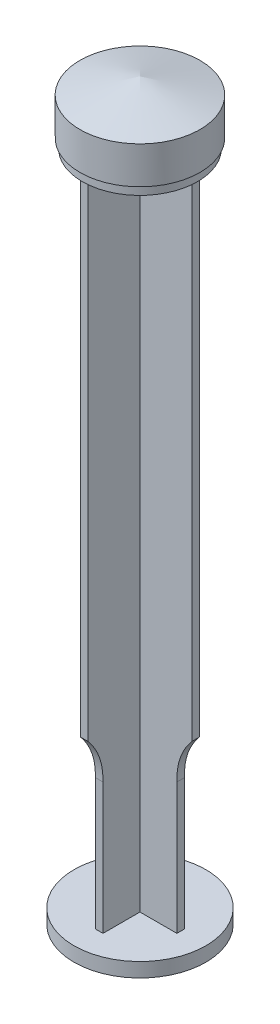
ISO-10303-21;
HEADER;
FILE_DESCRIPTION(('STEP AP214'),'2;1');
FILE_NAME('part.step','',(''),(''),'','','');
FILE_SCHEMA(('AUTOMOTIVE_DESIGN { 1 0 10303 214 1 1 1 1 }'));
ENDSEC;
DATA;
#1=APPLICATION_CONTEXT('core data for automotive mechanical design processes');
#2=APPLICATION_PROTOCOL_DEFINITION('international standard','automotive_design',2000,#1);
#3=PRODUCT_CONTEXT('',#1,'mechanical');
#4=PRODUCT('Part','Part','',(#3));
#5=PRODUCT_RELATED_PRODUCT_CATEGORY('part','',(#4));
#6=PRODUCT_DEFINITION_FORMATION('','',#4);
#7=PRODUCT_DEFINITION_CONTEXT('part definition',#1,'design');
#8=PRODUCT_DEFINITION('design','',#6,#7);
#9=PRODUCT_DEFINITION_SHAPE('','',#8);
#10=(LENGTH_UNIT() NAMED_UNIT(*) SI_UNIT(.MILLI.,.METRE.));
#11=(NAMED_UNIT(*) PLANE_ANGLE_UNIT() SI_UNIT($,.RADIAN.));
#12=(NAMED_UNIT(*) SI_UNIT($,.STERADIAN.) SOLID_ANGLE_UNIT());
#13=UNCERTAINTY_MEASURE_WITH_UNIT(LENGTH_MEASURE(1.E-05),#10,'distance_accuracy_value','');
#14=(GEOMETRIC_REPRESENTATION_CONTEXT(3) GLOBAL_UNCERTAINTY_ASSIGNED_CONTEXT((#13)) GLOBAL_UNIT_ASSIGNED_CONTEXT((#10,
#11,#12)) REPRESENTATION_CONTEXT('',''));
#15=CARTESIAN_POINT('',(0.,0.,0.));
#16=DIRECTION('',(0.,0.,1.));
#17=DIRECTION('',(1.,0.,0.));
#18=AXIS2_PLACEMENT_3D('',#15,#16,#17);
#19=CARTESIAN_POINT('',(-6.99999999999997,84.55,-0.475000000000002));
#20=DIRECTION('',(0.,0.,1.));
#21=DIRECTION('',(1.,0.,0.));
#22=AXIS2_PLACEMENT_3D('',#19,#20,#21);
#23=PLANE('',#22);
#24=DIRECTION('',(0.,-1.,0.));
#25=VECTOR('',#24,1.);
#26=CARTESIAN_POINT('',(-5.125,84.55,-0.475000000000002));
#27=LINE('',#26,#25);
#28=CARTESIAN_POINT('',(-5.125,18.3,-0.475000000000002));
#29=VERTEX_POINT('',#28);
#30=CARTESIAN_POINT('',(-5.125,1.8,-0.475000000000001));
#31=VERTEX_POINT('',#30);
#32=EDGE_CURVE('E378',#29,#31,#27,.T.);
#33=ORIENTED_EDGE('',*,*,#32,.F.);
#34=CARTESIAN_POINT('',(-5.125,18.3,-0.475000000000002));
#35=CARTESIAN_POINT('',(-5.02840034035996,21.345891771607,-0.475000000000002));
#36=CARTESIAN_POINT('',(-6.99999999999998,23.65,-0.475000000000002));
#37=B_SPLINE_CURVE_WITH_KNOTS('',2,(#34,#35,#36),.UNSPECIFIED.,.F.,.F.,(3,3),(0.,1.),.UNSPECIFIED.);
#38=CARTESIAN_POINT('',(-6.99999999999998,23.65,-0.475000000000002));
#39=VERTEX_POINT('',#38);
#40=EDGE_CURVE('E789',#39,#29,#37,.F.);
#41=ORIENTED_EDGE('',*,*,#40,.F.);
#42=DIRECTION('',(0.,-1.,0.));
#43=VECTOR('',#42,1.);
#44=CARTESIAN_POINT('',(-6.99999999999997,84.55,-0.475000000000002));
#45=LINE('',#44,#43);
#46=CARTESIAN_POINT('',(-6.99999999999997,84.55,-0.475000000000002));
#47=VERTEX_POINT('',#46);
#48=EDGE_CURVE('E252',#47,#39,#45,.T.);
#49=ORIENTED_EDGE('',*,*,#48,.F.);
#50=DIRECTION('',(-1.,0.,0.));
#51=VECTOR('',#50,1.);
#52=CARTESIAN_POINT('',(-6.99999999999997,84.55,-0.475000000000002));
#53=LINE('',#52,#51);
#54=CARTESIAN_POINT('',(-0.475,84.55,-0.475));
#55=VERTEX_POINT('',#54);
#56=EDGE_CURVE('E219',#55,#47,#53,.T.);
#57=ORIENTED_EDGE('',*,*,#56,.F.);
#58=DIRECTION('',(0.,-1.,0.));
#59=VECTOR('',#58,1.);
#60=CARTESIAN_POINT('',(-0.475,84.55,-0.475));
#61=LINE('',#60,#59);
#62=CARTESIAN_POINT('',(-0.475,1.8,-0.475));
#63=VERTEX_POINT('',#62);
#64=EDGE_CURVE('E220',#55,#63,#61,.T.);
#65=ORIENTED_EDGE('',*,*,#64,.T.);
#66=DIRECTION('',(-1.,0.,0.));
#67=VECTOR('',#66,1.);
#68=CARTESIAN_POINT('',(-6.99999999999997,1.8,-0.475000000000002));
#69=LINE('',#68,#67);
#70=EDGE_CURVE('E349',#63,#31,#69,.T.);
#71=ORIENTED_EDGE('',*,*,#70,.T.);
#72=EDGE_LOOP('',(#33,#41,#49,#57,#65,#71));
#73=FACE_BOUND('',#72,.T.);
#74=ADVANCED_FACE('F41',(#73),#23,.F.);
#75=CARTESIAN_POINT('',(-6.99999999999998,84.55,0.474999999999988));
#76=DIRECTION('',(1.,0.,0.));
#77=DIRECTION('',(0.,0.,-1.));
#78=AXIS2_PLACEMENT_3D('',#75,#76,#77);
#79=PLANE('',#78);
#80=DIRECTION('',(0.,0.,-1.));
#81=VECTOR('',#80,1.);
#82=CARTESIAN_POINT('',(-6.99999999999998,23.65,2.));
#83=LINE('',#82,#81);
#84=CARTESIAN_POINT('',(-6.99999999999998,23.65,0.474999999999988));
#85=VERTEX_POINT('',#84);
#86=EDGE_CURVE('E201',#85,#39,#83,.T.);
#87=ORIENTED_EDGE('',*,*,#86,.F.);
#88=DIRECTION('',(0.,-1.,0.));
#89=VECTOR('',#88,1.);
#90=CARTESIAN_POINT('',(-6.99999999999998,84.55,0.474999999999988));
#91=LINE('',#90,#89);
#92=CARTESIAN_POINT('',(-6.99999999999998,84.55,0.474999999999988));
#93=VERTEX_POINT('',#92);
#94=EDGE_CURVE('E249',#93,#85,#91,.T.);
#95=ORIENTED_EDGE('',*,*,#94,.F.);
#96=DIRECTION('',(0.,0.,1.));
#97=VECTOR('',#96,1.);
#98=CARTESIAN_POINT('',(-6.99999999999998,84.55,0.474999999999988));
#99=LINE('',#98,#97);
#100=EDGE_CURVE('E317',#47,#93,#99,.T.);
#101=ORIENTED_EDGE('',*,*,#100,.F.);
#102=ORIENTED_EDGE('',*,*,#48,.T.);
#103=EDGE_LOOP('',(#87,#95,#101,#102));
#104=FACE_BOUND('',#103,.T.);
#105=ADVANCED_FACE('F305',(#104),#79,.F.);
#106=CARTESIAN_POINT('',(-0.475,84.55,0.475000000000001));
#107=DIRECTION('',(0.,0.,-1.));
#108=DIRECTION('',(-1.,0.,0.));
#109=AXIS2_PLACEMENT_3D('',#106,#107,#108);
#110=PLANE('',#109);
#111=DIRECTION('',(0.,1.,0.));
#112=VECTOR('',#111,1.);
#113=CARTESIAN_POINT('',(-5.125,84.55,0.474999999999992));
#114=LINE('',#113,#112);
#115=CARTESIAN_POINT('',(-5.125,1.8,0.474999999999992));
#116=VERTEX_POINT('',#115);
#117=CARTESIAN_POINT('',(-5.125,18.3,0.475000000000001));
#118=VERTEX_POINT('',#117);
#119=EDGE_CURVE('E11',#116,#118,#114,.T.);
#120=ORIENTED_EDGE('',*,*,#119,.F.);
#121=DIRECTION('',(1.,0.,0.));
#122=VECTOR('',#121,1.);
#123=CARTESIAN_POINT('',(-0.475,1.8,0.475000000000001));
#124=LINE('',#123,#122);
#125=CARTESIAN_POINT('',(-0.475,1.8,0.475000000000001));
#126=VERTEX_POINT('',#125);
#127=EDGE_CURVE('E352',#116,#126,#124,.T.);
#128=ORIENTED_EDGE('',*,*,#127,.T.);
#129=DIRECTION('',(0.,-1.,0.));
#130=VECTOR('',#129,1.);
#131=CARTESIAN_POINT('',(-0.475,84.55,0.475000000000001));
#132=LINE('',#131,#130);
#133=CARTESIAN_POINT('',(-0.475,84.55,0.475000000000001));
#134=VERTEX_POINT('',#133);
#135=EDGE_CURVE('E246',#134,#126,#132,.T.);
#136=ORIENTED_EDGE('',*,*,#135,.F.);
#137=DIRECTION('',(1.,0.,0.));
#138=VECTOR('',#137,1.);
#139=CARTESIAN_POINT('',(-0.475,84.55,0.475000000000001));
#140=LINE('',#139,#138);
#141=EDGE_CURVE('E311',#93,#134,#140,.T.);
#142=ORIENTED_EDGE('',*,*,#141,.F.);
#143=ORIENTED_EDGE('',*,*,#94,.T.);
#144=CARTESIAN_POINT('',(-5.125,18.3,0.475000000000001));
#145=CARTESIAN_POINT('',(-5.02840034035996,21.345891771607,0.475000000000001));
#146=CARTESIAN_POINT('',(-6.99999999999998,23.65,0.475000000000001));
#147=B_SPLINE_CURVE_WITH_KNOTS('',2,(#144,#145,#146),.UNSPECIFIED.,.F.,.F.,(3,3),(0.,1.),.UNSPECIFIED.);
#148=EDGE_CURVE('E50',#118,#85,#147,.T.);
#149=ORIENTED_EDGE('',*,*,#148,.F.);
#150=EDGE_LOOP('',(#120,#128,#136,#142,#143,#149));
#151=FACE_BOUND('',#150,.T.);
#152=ADVANCED_FACE('F309',(#151),#110,.F.);
#153=CARTESIAN_POINT('',(6.99999999999999,84.55,0.475000000000007));
#154=DIRECTION('',(0.,0.,-1.));
#155=DIRECTION('',(-1.,0.,0.));
#156=AXIS2_PLACEMENT_3D('',#153,#154,#155);
#157=PLANE('',#156);
#158=CARTESIAN_POINT('',(6.99999999999998,23.65,0.475000000000007));
#159=CARTESIAN_POINT('',(5.02840034035996,21.345891771607,0.475000000000007));
#160=CARTESIAN_POINT('',(5.125,18.3,0.475000000000007));
#161=B_SPLINE_CURVE_WITH_KNOTS('',2,(#158,#159,#160),.UNSPECIFIED.,.F.,.F.,(3,3),(0.,1.),.UNSPECIFIED.);
#162=CARTESIAN_POINT('',(6.99999999999998,23.65,0.475000000000007));
#163=VERTEX_POINT('',#162);
#164=CARTESIAN_POINT('',(5.125,18.3,0.475000000000006));
#165=VERTEX_POINT('',#164);
#166=EDGE_CURVE('E188',#163,#165,#161,.T.);
#167=ORIENTED_EDGE('',*,*,#166,.F.);
#168=DIRECTION('',(0.,-1.,0.));
#169=VECTOR('',#168,1.);
#170=CARTESIAN_POINT('',(6.99999999999999,84.55,0.475000000000007));
#171=LINE('',#170,#169);
#172=CARTESIAN_POINT('',(6.99999999999999,84.55,0.475000000000007));
#173=VERTEX_POINT('',#172);
#174=EDGE_CURVE('E236',#173,#163,#171,.T.);
#175=ORIENTED_EDGE('',*,*,#174,.F.);
#176=DIRECTION('',(1.,0.,0.));
#177=VECTOR('',#176,1.);
#178=CARTESIAN_POINT('',(6.99999999999999,84.55,0.475000000000007));
#179=LINE('',#178,#177);
#180=CARTESIAN_POINT('',(0.475,84.55,0.475000000000001));
#181=VERTEX_POINT('',#180);
#182=EDGE_CURVE('E333',#181,#173,#179,.T.);
#183=ORIENTED_EDGE('',*,*,#182,.F.);
#184=DIRECTION('',(0.,-1.,0.));
#185=VECTOR('',#184,1.);
#186=CARTESIAN_POINT('',(0.475,84.55,0.475000000000001));
#187=LINE('',#186,#185);
#188=CARTESIAN_POINT('',(0.475,1.8,0.475000000000001));
#189=VERTEX_POINT('',#188);
#190=EDGE_CURVE('E206',#181,#189,#187,.T.);
#191=ORIENTED_EDGE('',*,*,#190,.T.);
#192=DIRECTION('',(1.,0.,0.));
#193=VECTOR('',#192,1.);
#194=CARTESIAN_POINT('',(6.99999999999999,1.8,0.475000000000007));
#195=LINE('',#194,#193);
#196=CARTESIAN_POINT('',(5.125,1.8,0.475000000000006));
#197=VERTEX_POINT('',#196);
#198=EDGE_CURVE('E198',#189,#197,#195,.T.);
#199=ORIENTED_EDGE('',*,*,#198,.T.);
#200=DIRECTION('',(0.,-1.,0.));
#201=VECTOR('',#200,1.);
#202=CARTESIAN_POINT('',(5.125,84.55,0.475000000000006));
#203=LINE('',#202,#201);
#204=EDGE_CURVE('E178',#165,#197,#203,.T.);
#205=ORIENTED_EDGE('',*,*,#204,.F.);
#206=EDGE_LOOP('',(#167,#175,#183,#191,#199,#205));
#207=FACE_BOUND('',#206,.T.);
#208=ADVANCED_FACE('F204',(#207),#157,.F.);
#209=CARTESIAN_POINT('',(6.99999999999997,84.55,-0.475));
#210=DIRECTION('',(-1.,0.,0.));
#211=DIRECTION('',(0.,0.,1.));
#212=AXIS2_PLACEMENT_3D('',#209,#210,#211);
#213=PLANE('',#212);
#214=DIRECTION('',(0.,0.,-1.));
#215=VECTOR('',#214,1.);
#216=CARTESIAN_POINT('',(6.99999999999998,23.65,2.));
#217=LINE('',#216,#215);
#218=CARTESIAN_POINT('',(6.99999999999998,23.65,-0.475));
#219=VERTEX_POINT('',#218);
#220=EDGE_CURVE('E748',#163,#219,#217,.T.);
#221=ORIENTED_EDGE('',*,*,#220,.T.);
#222=DIRECTION('',(0.,-1.,0.));
#223=VECTOR('',#222,1.);
#224=CARTESIAN_POINT('',(6.99999999999997,84.55,-0.475));
#225=LINE('',#224,#223);
#226=CARTESIAN_POINT('',(6.99999999999997,84.55,-0.475));
#227=VERTEX_POINT('',#226);
#228=EDGE_CURVE('E233',#227,#219,#225,.T.);
#229=ORIENTED_EDGE('',*,*,#228,.F.);
#230=DIRECTION('',(0.,0.,-1.));
#231=VECTOR('',#230,1.);
#232=CARTESIAN_POINT('',(6.99999999999997,84.55,-0.475));
#233=LINE('',#232,#231);
#234=EDGE_CURVE('E336',#173,#227,#233,.T.);
#235=ORIENTED_EDGE('',*,*,#234,.F.);
#236=ORIENTED_EDGE('',*,*,#174,.T.);
#237=EDGE_LOOP('',(#221,#229,#235,#236));
#238=FACE_BOUND('',#237,.T.);
#239=ADVANCED_FACE('F438',(#238),#213,.F.);
#240=CARTESIAN_POINT('',(0.475,84.55,-0.475));
#241=DIRECTION('',(0.,0.,1.));
#242=DIRECTION('',(1.,0.,0.));
#243=AXIS2_PLACEMENT_3D('',#240,#241,#242);
#244=PLANE('',#243);
#245=CARTESIAN_POINT('',(6.99999999999998,23.65,-0.475));
#246=CARTESIAN_POINT('',(5.02840034035996,21.345891771607,-0.475));
#247=CARTESIAN_POINT('',(5.125,18.3,-0.475));
#248=B_SPLINE_CURVE_WITH_KNOTS('',2,(#245,#246,#247),.UNSPECIFIED.,.F.,.F.,(3,3),(0.,1.),.UNSPECIFIED.);
#249=CARTESIAN_POINT('',(5.125,18.3,-0.475));
#250=VERTEX_POINT('',#249);
#251=EDGE_CURVE('E287',#250,#219,#248,.F.);
#252=ORIENTED_EDGE('',*,*,#251,.F.);
#253=DIRECTION('',(0.,1.,0.));
#254=VECTOR('',#253,1.);
#255=CARTESIAN_POINT('',(5.125,84.55,-0.475));
#256=LINE('',#255,#254);
#257=CARTESIAN_POINT('',(5.125,1.8,-0.475));
#258=VERTEX_POINT('',#257);
#259=EDGE_CURVE('E285',#258,#250,#256,.T.);
#260=ORIENTED_EDGE('',*,*,#259,.F.);
#261=DIRECTION('',(-1.,0.,0.));
#262=VECTOR('',#261,1.);
#263=CARTESIAN_POINT('',(0.475,1.8,-0.475));
#264=LINE('',#263,#262);
#265=CARTESIAN_POINT('',(0.475,1.8,-0.475));
#266=VERTEX_POINT('',#265);
#267=EDGE_CURVE('E200',#258,#266,#264,.T.);
#268=ORIENTED_EDGE('',*,*,#267,.T.);
#269=DIRECTION('',(0.,-1.,0.));
#270=VECTOR('',#269,1.);
#271=CARTESIAN_POINT('',(0.475,84.55,-0.475));
#272=LINE('',#271,#270);
#273=CARTESIAN_POINT('',(0.475,84.55,-0.475));
#274=VERTEX_POINT('',#273);
#275=EDGE_CURVE('E230',#274,#266,#272,.T.);
#276=ORIENTED_EDGE('',*,*,#275,.F.);
#277=DIRECTION('',(-1.,0.,0.));
#278=VECTOR('',#277,1.);
#279=CARTESIAN_POINT('',(0.475,84.55,-0.475));
#280=LINE('',#279,#278);
#281=EDGE_CURVE('E339',#227,#274,#280,.T.);
#282=ORIENTED_EDGE('',*,*,#281,.F.);
#283=ORIENTED_EDGE('',*,*,#228,.T.);
#284=EDGE_LOOP('',(#252,#260,#268,#276,#282,#283));
#285=FACE_BOUND('',#284,.T.);
#286=ADVANCED_FACE('F435',(#285),#244,.F.);
#287=CARTESIAN_POINT('',(-0.475000000000004,84.55,6.99999999999996));
#288=DIRECTION('',(1.,0.,0.));
#289=DIRECTION('',(0.,0.,-1.));
#290=AXIS2_PLACEMENT_3D('',#287,#288,#289);
#291=PLANE('',#290);
#292=DIRECTION('',(0.,-1.,0.));
#293=VECTOR('',#292,1.);
#294=CARTESIAN_POINT('',(-0.475000000000003,84.55,5.125));
#295=LINE('',#294,#293);
#296=CARTESIAN_POINT('',(-0.475000000000005,18.3,5.125));
#297=VERTEX_POINT('',#296);
#298=CARTESIAN_POINT('',(-0.475000000000003,1.8,5.125));
#299=VERTEX_POINT('',#298);
#300=EDGE_CURVE('E360',#297,#299,#295,.T.);
#301=ORIENTED_EDGE('',*,*,#300,.F.);
#302=CARTESIAN_POINT('',(-0.475000000000006,18.3,5.125));
#303=CARTESIAN_POINT('',(-0.475000000000006,21.3387368003838,5.05954918686191));
#304=CARTESIAN_POINT('',(-0.475000000000004,23.65,6.99999999999996));
#305=B_SPLINE_CURVE_WITH_KNOTS('',2,(#302,#303,#304),.UNSPECIFIED.,.F.,.F.,(3,3),(0.,1.),.UNSPECIFIED.);
#306=CARTESIAN_POINT('',(-0.475000000000004,23.65,6.99999999999996));
#307=VERTEX_POINT('',#306);
#308=EDGE_CURVE('E769',#307,#297,#305,.F.);
#309=ORIENTED_EDGE('',*,*,#308,.F.);
#310=DIRECTION('',(0.,-1.,0.));
#311=VECTOR('',#310,1.);
#312=CARTESIAN_POINT('',(-0.475000000000004,84.55,6.99999999999996));
#313=LINE('',#312,#311);
#314=CARTESIAN_POINT('',(-0.475000000000004,84.55,6.99999999999996));
#315=VERTEX_POINT('',#314);
#316=EDGE_CURVE('E243',#315,#307,#313,.T.);
#317=ORIENTED_EDGE('',*,*,#316,.F.);
#318=DIRECTION('',(0.,0.,1.));
#319=VECTOR('',#318,1.);
#320=CARTESIAN_POINT('',(-0.475000000000004,84.55,6.99999999999996));
#321=LINE('',#320,#319);
#322=EDGE_CURVE('E316',#134,#315,#321,.T.);
#323=ORIENTED_EDGE('',*,*,#322,.F.);
#324=ORIENTED_EDGE('',*,*,#135,.T.);
#325=DIRECTION('',(0.,0.,1.));
#326=VECTOR('',#325,1.);
#327=CARTESIAN_POINT('',(-0.475000000000004,1.8,6.99999999999996));
#328=LINE('',#327,#326);
#329=EDGE_CURVE('E211',#126,#299,#328,.T.);
#330=ORIENTED_EDGE('',*,*,#329,.T.);
#331=EDGE_LOOP('',(#301,#309,#317,#323,#324,#330));
#332=FACE_BOUND('',#331,.T.);
#333=ADVANCED_FACE('F358',(#332),#291,.F.);
#334=CARTESIAN_POINT('',(0.475000000000004,84.55,6.99999999999996));
#335=DIRECTION('',(0.,0.,-1.));
#336=DIRECTION('',(-1.,0.,0.));
#337=AXIS2_PLACEMENT_3D('',#334,#335,#336);
#338=PLANE('',#337);
#339=DIRECTION('',(-1.,0.,0.));
#340=VECTOR('',#339,1.);
#341=CARTESIAN_POINT('',(2.475,23.65,6.99999999999996));
#342=LINE('',#341,#340);
#343=CARTESIAN_POINT('',(0.475000000000004,23.65,6.99999999999996));
#344=VERTEX_POINT('',#343);
#345=EDGE_CURVE('E370',#344,#307,#342,.T.);
#346=ORIENTED_EDGE('',*,*,#345,.F.);
#347=DIRECTION('',(0.,-1.,0.));
#348=VECTOR('',#347,1.);
#349=CARTESIAN_POINT('',(0.475000000000004,84.55,6.99999999999996));
#350=LINE('',#349,#348);
#351=CARTESIAN_POINT('',(0.475000000000004,84.55,6.99999999999996));
#352=VERTEX_POINT('',#351);
#353=EDGE_CURVE('E240',#352,#344,#350,.T.);
#354=ORIENTED_EDGE('',*,*,#353,.F.);
#355=DIRECTION('',(1.,0.,0.));
#356=VECTOR('',#355,1.);
#357=CARTESIAN_POINT('',(0.475000000000004,84.55,6.99999999999996));
#358=LINE('',#357,#356);
#359=EDGE_CURVE('E327',#315,#352,#358,.T.);
#360=ORIENTED_EDGE('',*,*,#359,.F.);
#361=ORIENTED_EDGE('',*,*,#316,.T.);
#362=EDGE_LOOP('',(#346,#354,#360,#361));
#363=FACE_BOUND('',#362,.T.);
#364=ADVANCED_FACE('F447',(#363),#338,.F.);
#365=CARTESIAN_POINT('',(0.475,84.55,0.475000000000001));
#366=DIRECTION('',(-1.,0.,0.));
#367=DIRECTION('',(0.,0.,1.));
#368=AXIS2_PLACEMENT_3D('',#365,#366,#367);
#369=PLANE('',#368);
#370=DIRECTION('',(0.,1.,0.));
#371=VECTOR('',#370,1.);
#372=CARTESIAN_POINT('',(0.475000000000003,84.55,5.125));
#373=LINE('',#372,#371);
#374=CARTESIAN_POINT('',(0.475000000000003,1.8,5.125));
#375=VERTEX_POINT('',#374);
#376=CARTESIAN_POINT('',(0.475000000000003,18.3,5.125));
#377=VERTEX_POINT('',#376);
#378=EDGE_CURVE('E280',#375,#377,#373,.T.);
#379=ORIENTED_EDGE('',*,*,#378,.F.);
#380=DIRECTION('',(0.,0.,-1.));
#381=VECTOR('',#380,1.);
#382=CARTESIAN_POINT('',(0.475,1.8,0.475000000000001));
#383=LINE('',#382,#381);
#384=EDGE_CURVE('E207',#375,#189,#383,.T.);
#385=ORIENTED_EDGE('',*,*,#384,.T.);
#386=ORIENTED_EDGE('',*,*,#190,.F.);
#387=DIRECTION('',(0.,0.,-1.));
#388=VECTOR('',#387,1.);
#389=CARTESIAN_POINT('',(0.475,84.55,0.475000000000001));
#390=LINE('',#389,#388);
#391=EDGE_CURVE('E330',#352,#181,#390,.T.);
#392=ORIENTED_EDGE('',*,*,#391,.F.);
#393=ORIENTED_EDGE('',*,*,#353,.T.);
#394=CARTESIAN_POINT('',(0.475000000000003,18.3,5.125));
#395=CARTESIAN_POINT('',(0.475000000000003,21.3387368003838,5.05954918686191));
#396=CARTESIAN_POINT('',(0.475000000000004,23.65,6.99999999999996));
#397=B_SPLINE_CURVE_WITH_KNOTS('',2,(#394,#395,#396),.UNSPECIFIED.,.F.,.F.,(3,3),(0.,1.),.UNSPECIFIED.);
#398=EDGE_CURVE('E273',#377,#344,#397,.T.);
#399=ORIENTED_EDGE('',*,*,#398,.F.);
#400=EDGE_LOOP('',(#379,#385,#386,#392,#393,#399));
#401=FACE_BOUND('',#400,.T.);
#402=ADVANCED_FACE('F433',(#401),#369,.F.);
#403=CARTESIAN_POINT('',(0.475000000000001,84.55,-6.99999999999995));
#404=DIRECTION('',(-1.,0.,0.));
#405=DIRECTION('',(0.,0.,1.));
#406=AXIS2_PLACEMENT_3D('',#403,#404,#405);
#407=PLANE('',#406);
#408=CARTESIAN_POINT('',(0.475000000000001,23.65,-6.99999999999996));
#409=CARTESIAN_POINT('',(0.475000000000002,21.3387368003838,-5.05954918686191));
#410=CARTESIAN_POINT('',(0.475000000000002,18.3,-5.125));
#411=B_SPLINE_CURVE_WITH_KNOTS('',2,(#408,#409,#410),.UNSPECIFIED.,.F.,.F.,(3,3),(0.,1.),.UNSPECIFIED.);
#412=CARTESIAN_POINT('',(0.475000000000001,23.65,-6.99999999999996));
#413=VERTEX_POINT('',#412);
#414=CARTESIAN_POINT('',(0.475000000000001,18.3,-5.125));
#415=VERTEX_POINT('',#414);
#416=EDGE_CURVE('E368',#413,#415,#411,.T.);
#417=ORIENTED_EDGE('',*,*,#416,.F.);
#418=DIRECTION('',(0.,-1.,0.));
#419=VECTOR('',#418,1.);
#420=CARTESIAN_POINT('',(0.475000000000001,84.55,-6.99999999999995));
#421=LINE('',#420,#419);
#422=CARTESIAN_POINT('',(0.475000000000001,84.55,-6.99999999999995));
#423=VERTEX_POINT('',#422);
#424=EDGE_CURVE('E227',#423,#413,#421,.T.);
#425=ORIENTED_EDGE('',*,*,#424,.F.);
#426=DIRECTION('',(0.,0.,-1.));
#427=VECTOR('',#426,1.);
#428=CARTESIAN_POINT('',(0.475000000000001,84.55,-6.99999999999995));
#429=LINE('',#428,#427);
#430=EDGE_CURVE('E342',#274,#423,#429,.T.);
#431=ORIENTED_EDGE('',*,*,#430,.F.);
#432=ORIENTED_EDGE('',*,*,#275,.T.);
#433=DIRECTION('',(0.,0.,-1.));
#434=VECTOR('',#433,1.);
#435=CARTESIAN_POINT('',(0.475000000000001,1.8,-6.99999999999995));
#436=LINE('',#435,#434);
#437=CARTESIAN_POINT('',(0.475000000000001,1.8,-5.125));
#438=VERTEX_POINT('',#437);
#439=EDGE_CURVE('E209',#266,#438,#436,.T.);
#440=ORIENTED_EDGE('',*,*,#439,.T.);
#441=DIRECTION('',(0.,-1.,0.));
#442=VECTOR('',#441,1.);
#443=CARTESIAN_POINT('',(0.475000000000001,84.55,-5.125));
#444=LINE('',#443,#442);
#445=EDGE_CURVE('E366',#415,#438,#444,.T.);
#446=ORIENTED_EDGE('',*,*,#445,.F.);
#447=EDGE_LOOP('',(#417,#425,#431,#432,#440,#446));
#448=FACE_BOUND('',#447,.T.);
#449=ADVANCED_FACE('F429',(#448),#407,.F.);
#450=CARTESIAN_POINT('',(-0.475000000000001,84.55,-6.99999999999995));
#451=DIRECTION('',(0.,0.,1.));
#452=DIRECTION('',(1.,0.,0.));
#453=AXIS2_PLACEMENT_3D('',#450,#451,#452);
#454=PLANE('',#453);
#455=DIRECTION('',(-1.,0.,0.));
#456=VECTOR('',#455,1.);
#457=CARTESIAN_POINT('',(2.475,23.65,-6.99999999999996));
#458=LINE('',#457,#456);
#459=CARTESIAN_POINT('',(-0.475000000000003,23.65,-6.99999999999996));
#460=VERTEX_POINT('',#459);
#461=EDGE_CURVE('E374',#413,#460,#458,.T.);
#462=ORIENTED_EDGE('',*,*,#461,.T.);
#463=DIRECTION('',(0.,-1.,0.));
#464=VECTOR('',#463,1.);
#465=CARTESIAN_POINT('',(-0.475000000000001,84.55,-6.99999999999995));
#466=LINE('',#465,#464);
#467=CARTESIAN_POINT('',(-0.475000000000001,84.55,-6.99999999999995));
#468=VERTEX_POINT('',#467);
#469=EDGE_CURVE('E223',#468,#460,#466,.T.);
#470=ORIENTED_EDGE('',*,*,#469,.F.);
#471=DIRECTION('',(-1.,0.,0.));
#472=VECTOR('',#471,1.);
#473=CARTESIAN_POINT('',(-0.475000000000001,84.55,-6.99999999999995));
#474=LINE('',#473,#472);
#475=EDGE_CURVE('E345',#423,#468,#474,.T.);
#476=ORIENTED_EDGE('',*,*,#475,.F.);
#477=ORIENTED_EDGE('',*,*,#424,.T.);
#478=EDGE_LOOP('',(#462,#470,#476,#477));
#479=FACE_BOUND('',#478,.T.);
#480=ADVANCED_FACE('F425',(#479),#454,.F.);
#481=CARTESIAN_POINT('',(-0.475,84.55,-0.475));
#482=DIRECTION('',(1.,0.,0.));
#483=DIRECTION('',(0.,0.,-1.));
#484=AXIS2_PLACEMENT_3D('',#481,#482,#483);
#485=PLANE('',#484);
#486=CARTESIAN_POINT('',(-0.475000000000003,23.65,-6.99999999999996));
#487=CARTESIAN_POINT('',(-0.475000000000002,21.3387368003838,-5.05954918686191));
#488=CARTESIAN_POINT('',(-0.475000000000002,18.3,-5.125));
#489=B_SPLINE_CURVE_WITH_KNOTS('',2,(#486,#487,#488),.UNSPECIFIED.,.F.,.F.,(3,3),(0.,1.),.UNSPECIFIED.);
#490=CARTESIAN_POINT('',(-0.475000000000001,18.3,-5.125));
#491=VERTEX_POINT('',#490);
#492=EDGE_CURVE('E269',#491,#460,#489,.F.);
#493=ORIENTED_EDGE('',*,*,#492,.F.);
#494=DIRECTION('',(0.,1.,0.));
#495=VECTOR('',#494,1.);
#496=CARTESIAN_POINT('',(-0.475000000000001,84.55,-5.125));
#497=LINE('',#496,#495);
#498=CARTESIAN_POINT('',(-0.475000000000001,1.8,-5.125));
#499=VERTEX_POINT('',#498);
#500=EDGE_CURVE('E267',#499,#491,#497,.T.);
#501=ORIENTED_EDGE('',*,*,#500,.F.);
#502=DIRECTION('',(0.,0.,1.));
#503=VECTOR('',#502,1.);
#504=CARTESIAN_POINT('',(-0.475,1.8,-0.475));
#505=LINE('',#504,#503);
#506=EDGE_CURVE('E217',#499,#63,#505,.T.);
#507=ORIENTED_EDGE('',*,*,#506,.T.);
#508=ORIENTED_EDGE('',*,*,#64,.F.);
#509=DIRECTION('',(0.,0.,1.));
#510=VECTOR('',#509,1.);
#511=CARTESIAN_POINT('',(-0.475,84.55,-0.475));
#512=LINE('',#511,#510);
#513=EDGE_CURVE('E224',#468,#55,#512,.T.);
#514=ORIENTED_EDGE('',*,*,#513,.F.);
#515=ORIENTED_EDGE('',*,*,#469,.T.);
#516=EDGE_LOOP('',(#493,#501,#507,#508,#514,#515));
#517=FACE_BOUND('',#516,.T.);
#518=ADVANCED_FACE('F422',(#517),#485,.F.);
#519=CARTESIAN_POINT('',(0.,1.8,0.));
#520=DIRECTION('',(0.,1.,0.));
#521=DIRECTION('',(0.,0.,1.));
#522=AXIS2_PLACEMENT_3D('',#519,#520,#521);
#523=PLANE('',#522);
#524=DIRECTION('',(0.,0.,-1.));
#525=VECTOR('',#524,1.);
#526=CARTESIAN_POINT('',(-5.125,1.8,2.));
#527=LINE('',#526,#525);
#528=EDGE_CURVE('E189',#116,#31,#527,.T.);
#529=ORIENTED_EDGE('',*,*,#528,.T.);
#530=ORIENTED_EDGE('',*,*,#70,.F.);
#531=ORIENTED_EDGE('',*,*,#506,.F.);
#532=DIRECTION('',(-1.,0.,0.));
#533=VECTOR('',#532,1.);
#534=CARTESIAN_POINT('',(2.475,1.8,-5.125));
#535=LINE('',#534,#533);
#536=EDGE_CURVE('E381',#438,#499,#535,.T.);
#537=ORIENTED_EDGE('',*,*,#536,.F.);
#538=ORIENTED_EDGE('',*,*,#439,.F.);
#539=ORIENTED_EDGE('',*,*,#267,.F.);
#540=DIRECTION('',(0.,0.,-1.));
#541=VECTOR('',#540,1.);
#542=CARTESIAN_POINT('',(5.125,1.8,2.));
#543=LINE('',#542,#541);
#544=EDGE_CURVE('E181',#197,#258,#543,.T.);
#545=ORIENTED_EDGE('',*,*,#544,.F.);
#546=ORIENTED_EDGE('',*,*,#198,.F.);
#547=ORIENTED_EDGE('',*,*,#384,.F.);
#548=DIRECTION('',(-1.,0.,0.));
#549=VECTOR('',#548,1.);
#550=CARTESIAN_POINT('',(2.475,1.8,5.125));
#551=LINE('',#550,#549);
#552=EDGE_CURVE('E363',#375,#299,#551,.T.);
#553=ORIENTED_EDGE('',*,*,#552,.T.);
#554=ORIENTED_EDGE('',*,*,#329,.F.);
#555=ORIENTED_EDGE('',*,*,#127,.F.);
#556=EDGE_LOOP('',(#529,#530,#531,#537,#538,#539,#545,#546,#547,#553,#554,#555));
#557=FACE_BOUND('',#556,.T.);
#558=CARTESIAN_POINT('',(0.,1.8,0.));
#559=DIRECTION('',(0.,1.,0.));
#560=DIRECTION('',(0.,0.,1.));
#561=AXIS2_PLACEMENT_3D('',#558,#559,#560);
#562=CIRCLE('',#561,8.3);
#563=CARTESIAN_POINT('',(0.,1.8,8.3));
#564=VERTEX_POINT('',#563);
#565=EDGE_CURVE('E256',#564,#564,#562,.T.);
#566=ORIENTED_EDGE('',*,*,#565,.T.);
#567=EDGE_LOOP('',(#566));
#568=FACE_BOUND('',#567,.T.);
#569=ADVANCED_FACE('F195',(#557,#568),#523,.T.);
#570=CARTESIAN_POINT('',(0.,1.8,0.));
#571=DIRECTION('',(0.,-1.,0.));
#572=DIRECTION('',(0.,0.,-1.));
#573=AXIS2_PLACEMENT_3D('',#570,#571,#572);
#574=CYLINDRICAL_SURFACE('',#573,8.3);
#575=ORIENTED_EDGE('',*,*,#565,.F.);
#576=EDGE_LOOP('',(#575));
#577=FACE_BOUND('',#576,.T.);
#578=CARTESIAN_POINT('',(0.,0.,0.));
#579=DIRECTION('',(0.,1.,0.));
#580=DIRECTION('',(0.,0.,1.));
#581=AXIS2_PLACEMENT_3D('',#578,#579,#580);
#582=CIRCLE('',#581,8.3);
#583=CARTESIAN_POINT('',(0.,0.,8.3));
#584=VERTEX_POINT('',#583);
#585=EDGE_CURVE('E255',#584,#584,#582,.T.);
#586=ORIENTED_EDGE('',*,*,#585,.T.);
#587=EDGE_LOOP('',(#586));
#588=FACE_BOUND('',#587,.T.);
#589=ADVANCED_FACE('F463',(#577,#588),#574,.T.);
#590=CARTESIAN_POINT('',(0.,0.,0.));
#591=DIRECTION('',(0.,1.,0.));
#592=DIRECTION('',(0.,0.,1.));
#593=AXIS2_PLACEMENT_3D('',#590,#591,#592);
#594=PLANE('',#593);
#595=ORIENTED_EDGE('',*,*,#585,.F.);
#596=EDGE_LOOP('',(#595));
#597=FACE_BOUND('',#596,.T.);
#598=ADVANCED_FACE('F417',(#597),#594,.F.);
#599=CARTESIAN_POINT('',(0.,84.55,0.));
#600=DIRECTION('',(0.,1.,0.));
#601=DIRECTION('',(0.,0.,1.));
#602=AXIS2_PLACEMENT_3D('',#599,#600,#601);
#603=PLANE('',#602);
#604=CARTESIAN_POINT('',(0.,84.55,0.));
#605=DIRECTION('',(0.,1.,0.));
#606=DIRECTION('',(0.,0.,1.));
#607=AXIS2_PLACEMENT_3D('',#604,#605,#606);
#608=CIRCLE('',#607,7.25);
#609=CARTESIAN_POINT('',(0.,84.55,7.25));
#610=VERTEX_POINT('',#609);
#611=EDGE_CURVE('E816',#610,#610,#608,.T.);
#612=ORIENTED_EDGE('',*,*,#611,.F.);
#613=EDGE_LOOP('',(#612));
#614=FACE_BOUND('',#613,.T.);
#615=ORIENTED_EDGE('',*,*,#513,.T.);
#616=ORIENTED_EDGE('',*,*,#56,.T.);
#617=ORIENTED_EDGE('',*,*,#100,.T.);
#618=ORIENTED_EDGE('',*,*,#141,.T.);
#619=ORIENTED_EDGE('',*,*,#322,.T.);
#620=ORIENTED_EDGE('',*,*,#359,.T.);
#621=ORIENTED_EDGE('',*,*,#391,.T.);
#622=ORIENTED_EDGE('',*,*,#182,.T.);
#623=ORIENTED_EDGE('',*,*,#234,.T.);
#624=ORIENTED_EDGE('',*,*,#281,.T.);
#625=ORIENTED_EDGE('',*,*,#430,.T.);
#626=ORIENTED_EDGE('',*,*,#475,.T.);
#627=EDGE_LOOP('',(#615,#616,#617,#618,#619,#620,#621,#622,#623,#624,#625,#626));
#628=FACE_BOUND('',#627,.T.);
#629=ADVANCED_FACE('F321',(#614,#628),#603,.F.);
#630=CARTESIAN_POINT('',(0.,85.7,0.));
#631=DIRECTION('',(0.,-1.,0.));
#632=DIRECTION('',(0.,0.,-1.));
#633=AXIS2_PLACEMENT_3D('',#630,#631,#632);
#634=CYLINDRICAL_SURFACE('',#633,7.25);
#635=CARTESIAN_POINT('',(0.,85.7,0.));
#636=DIRECTION('',(0.,1.,0.));
#637=DIRECTION('',(0.,0.,1.));
#638=AXIS2_PLACEMENT_3D('',#635,#636,#637);
#639=CIRCLE('',#638,7.25);
#640=CARTESIAN_POINT('',(0.,85.7,7.25));
#641=VERTEX_POINT('',#640);
#642=EDGE_CURVE('E353',#641,#641,#639,.T.);
#643=ORIENTED_EDGE('',*,*,#642,.F.);
#644=EDGE_LOOP('',(#643));
#645=FACE_BOUND('',#644,.T.);
#646=ORIENTED_EDGE('',*,*,#611,.T.);
#647=EDGE_LOOP('',(#646));
#648=FACE_BOUND('',#647,.T.);
#649=ADVANCED_FACE('F413',(#645,#648),#634,.T.);
#650=CARTESIAN_POINT('',(0.,92.4,0.));
#651=DIRECTION('',(0.,-1.,0.));
#652=DIRECTION('',(0.,0.,-1.));
#653=AXIS2_PLACEMENT_3D('',#650,#651,#652);
#654=CYLINDRICAL_SURFACE('',#653,7.55);
#655=CARTESIAN_POINT('',(0.,90.377,0.));
#656=DIRECTION('',(0.,1.,0.));
#657=DIRECTION('',(0.,0.,1.));
#658=AXIS2_PLACEMENT_3D('',#655,#656,#657);
#659=CIRCLE('',#658,7.55);
#660=CARTESIAN_POINT('',(0.,90.377,-7.55000000000002));
#661=VERTEX_POINT('',#660);
#662=EDGE_CURVE('E264',#661,#661,#659,.F.);
#663=ORIENTED_EDGE('',*,*,#662,.T.);
#664=EDGE_LOOP('',(#663));
#665=FACE_BOUND('',#664,.T.);
#666=CARTESIAN_POINT('',(0.,85.7,0.));
#667=DIRECTION('',(0.,1.,0.));
#668=DIRECTION('',(0.,0.,1.));
#669=AXIS2_PLACEMENT_3D('',#666,#667,#668);
#670=CIRCLE('',#669,7.55);
#671=CARTESIAN_POINT('',(0.,85.7,7.55));
#672=VERTEX_POINT('',#671);
#673=EDGE_CURVE('E813',#672,#672,#670,.T.);
#674=ORIENTED_EDGE('',*,*,#673,.T.);
#675=EDGE_LOOP('',(#674));
#676=FACE_BOUND('',#675,.T.);
#677=ADVANCED_FACE('F406',(#665,#676),#654,.T.);
#678=CARTESIAN_POINT('',(0.,92.4,0.));
#679=DIRECTION('',(0.,1.,0.));
#680=DIRECTION('',(0.,0.,1.));
#681=AXIS2_PLACEMENT_3D('',#678,#679,#680);
#682=PLANE('',#681);
#683=CARTESIAN_POINT('',(0.,92.4,0.));
#684=DIRECTION('',(0.,1.,0.));
#685=DIRECTION('',(0.,0.,1.));
#686=AXIS2_PLACEMENT_3D('',#683,#684,#685);
#687=CIRCLE('',#686,6.12162881913347E-05);
#688=CARTESIAN_POINT('',(0.,92.4,-6.1216288217231E-05));
#689=VERTEX_POINT('',#688);
#690=EDGE_CURVE('E259',#689,#689,#687,.T.);
#691=ORIENTED_EDGE('',*,*,#690,.T.);
#692=EDGE_LOOP('',(#691));
#693=FACE_BOUND('',#692,.T.);
#694=ADVANCED_FACE('F402',(#693),#682,.T.);
#695=CARTESIAN_POINT('',(0.,85.7,0.));
#696=DIRECTION('',(0.,1.,0.));
#697=DIRECTION('',(0.,0.,1.));
#698=AXIS2_PLACEMENT_3D('',#695,#696,#697);
#699=PLANE('',#698);
#700=ORIENTED_EDGE('',*,*,#642,.T.);
#701=EDGE_LOOP('',(#700));
#702=FACE_BOUND('',#701,.T.);
#703=ORIENTED_EDGE('',*,*,#673,.F.);
#704=EDGE_LOOP('',(#703));
#705=FACE_BOUND('',#704,.T.);
#706=ADVANCED_FACE('F405',(#702,#705),#699,.F.);
#707=CARTESIAN_POINT('',(0.,92.4,0.));
#708=DIRECTION('',(0.,-1.,0.));
#709=DIRECTION('',(0.,0.,-1.));
#710=AXIS2_PLACEMENT_3D('',#707,#708,#709);
#711=CONICAL_SURFACE('',#710,6.12162881913347E-05,1.30899693899575);
#712=CARTESIAN_POINT('',(0.,90.377,-7.55000000000002));
#713=CARTESIAN_POINT('',(0.,90.3980729166666,-7.47135480433636));
#714=CARTESIAN_POINT('',(0.,90.4191458333333,-7.3927096086727));
#715=CARTESIAN_POINT('',(0.,90.4612916666667,-7.23541921734537));
#716=CARTESIAN_POINT('',(0.,90.4823645833333,-7.1567740216817));
#717=CARTESIAN_POINT('',(0.,90.5245104166667,-6.99948363035437));
#718=CARTESIAN_POINT('',(0.,90.5455833333333,-6.92083843469071));
#719=CARTESIAN_POINT('',(0.,90.5877291666667,-6.76354804336338));
#720=CARTESIAN_POINT('',(0.,90.6088020833333,-6.68490284769971));
#721=CARTESIAN_POINT('',(0.,90.6509479166667,-6.52761245637239));
#722=CARTESIAN_POINT('',(0.,90.6720208333333,-6.44896726070872));
#723=CARTESIAN_POINT('',(0.,90.7141666666667,-6.29167686938139));
#724=CARTESIAN_POINT('',(0.,90.7352395833333,-6.21303167371773));
#725=CARTESIAN_POINT('',(0.,90.7773854166667,-6.0557412823904));
#726=CARTESIAN_POINT('',(0.,90.7984583333333,-5.97709608672673));
#727=CARTESIAN_POINT('',(0.,90.8406041666667,-5.8198056953994));
#728=CARTESIAN_POINT('',(0.,90.8616770833333,-5.74116049973574));
#729=CARTESIAN_POINT('',(0.,90.9038229166667,-5.58387010840841));
#730=CARTESIAN_POINT('',(0.,90.9248958333333,-5.50522491274474));
#731=CARTESIAN_POINT('',(0.,90.9670416666667,-5.34793452141742));
#732=CARTESIAN_POINT('',(0.,90.9881145833333,-5.26928932575375));
#733=CARTESIAN_POINT('',(0.,91.0302604166667,-5.11199893442642));
#734=CARTESIAN_POINT('',(0.,91.0513333333333,-5.03335373876275));
#735=CARTESIAN_POINT('',(0.,91.0934791666667,-4.87606334743543));
#736=CARTESIAN_POINT('',(0.,91.1145520833333,-4.79741815177176));
#737=CARTESIAN_POINT('',(0.,91.1566979166667,-4.64012776044443));
#738=CARTESIAN_POINT('',(0.,91.1777708333333,-4.56148256478077));
#739=CARTESIAN_POINT('',(0.,91.2199166666667,-4.40419217345344));
#740=CARTESIAN_POINT('',(0.,91.2409895833333,-4.32554697778977));
#741=CARTESIAN_POINT('',(0.,91.2831354166667,-4.16825658646244));
#742=CARTESIAN_POINT('',(0.,91.3042083333333,-4.08961139079878));
#743=CARTESIAN_POINT('',(0.,91.3463541666667,-3.93232099947145));
#744=CARTESIAN_POINT('',(0.,91.3674270833333,-3.85367580380779));
#745=CARTESIAN_POINT('',(0.,91.4095729166666,-3.69638541248046));
#746=CARTESIAN_POINT('',(0.,91.4306458333333,-3.61774021681679));
#747=CARTESIAN_POINT('',(0.,91.4727916666667,-3.46044982548946));
#748=CARTESIAN_POINT('',(0.,91.4938645833333,-3.3818046298258));
#749=CARTESIAN_POINT('',(0.,91.5360104166667,-3.22451423849847));
#750=CARTESIAN_POINT('',(0.,91.5570833333333,-3.1458690428348));
#751=CARTESIAN_POINT('',(0.,91.5992291666667,-2.98857865150747));
#752=CARTESIAN_POINT('',(0.,91.6203020833333,-2.90993345584381));
#753=CARTESIAN_POINT('',(0.,91.6624479166667,-2.75264306451648));
#754=CARTESIAN_POINT('',(0.,91.6835208333333,-2.67399786885282));
#755=CARTESIAN_POINT('',(0.,91.7256666666667,-2.51670747752549));
#756=CARTESIAN_POINT('',(0.,91.7467395833333,-2.43806228186182));
#757=CARTESIAN_POINT('',(0.,91.7888854166667,-2.28077189053449));
#758=CARTESIAN_POINT('',(0.,91.8099583333333,-2.20212669487083));
#759=CARTESIAN_POINT('',(0.,91.8521041666667,-2.0448363035435));
#760=CARTESIAN_POINT('',(0.,91.8731770833333,-1.96619110787983));
#761=CARTESIAN_POINT('',(0.,91.9153229166667,-1.8089007165525));
#762=CARTESIAN_POINT('',(0.,91.9363958333333,-1.73025552088884));
#763=CARTESIAN_POINT('',(0.,91.9785416666667,-1.57296512956151));
#764=CARTESIAN_POINT('',(0.,91.9996145833333,-1.49431993389785));
#765=CARTESIAN_POINT('',(0.,92.0417604166667,-1.33702954257052));
#766=CARTESIAN_POINT('',(0.,92.0628333333333,-1.25838434690685));
#767=CARTESIAN_POINT('',(0.,92.1049791666667,-1.10109395557952));
#768=CARTESIAN_POINT('',(0.,92.1260520833333,-1.02244875991586));
#769=CARTESIAN_POINT('',(0.,92.1681979166667,-0.865158368588529));
#770=CARTESIAN_POINT('',(0.,92.1892708333333,-0.786513172924864));
#771=CARTESIAN_POINT('',(0.,92.2314166666667,-0.629222781597534));
#772=CARTESIAN_POINT('',(0.,92.2524895833333,-0.55057758593387));
#773=CARTESIAN_POINT('',(0.,92.2946354166667,-0.393287194606541));
#774=CARTESIAN_POINT('',(0.,92.3157083333333,-0.314641998942876));
#775=CARTESIAN_POINT('',(0.,92.3578541666667,-0.157351607615547));
#776=CARTESIAN_POINT('',(0.,92.3789270833333,-0.0787064119518818));
#777=CARTESIAN_POINT('',(0.,92.4,-6.1216288217231E-05));
#778=B_SPLINE_CURVE_WITH_KNOTS('',3,(#712,#713,#714,#715,#716,#717,#718,#719,#720,#721,#722,
#723,#724,#725,#726,#727,#728,#729,#730,#731,#732,#733,#734,#735,#736,#737,#738,#739,#740,#741,
#742,#743,#744,#745,#746,#747,#748,#749,#750,#751,#752,#753,#754,#755,#756,#757,#758,#759,#760,
#761,#762,#763,#764,#765,#766,#767,#768,#769,#770,#771,#772,#773,#774,#775,#776,#777),
.UNSPECIFIED.,.F.,.F.,(4,2,2,2,2,2,2,2,2,2,2,2,2,2,2,2,2,2,2,2,2,2,2,2,2,2,2,2,2,2,2,2,4),(0.,
0.24425849332285,0.488516986645696,0.732775479968542,0.977033973291392,1.22129246661424,
1.46555095993708,1.70980945325993,1.95406794658278,2.19832643990563,2.44258493322847,
2.68684342655132,2.93110191987417,3.17536041319702,3.41961890651986,3.66387739984271,
3.90813589316555,4.1523943864884,4.39665287981125,4.6409113731341,4.88516986645695,
5.12942835977979,5.37368685310264,5.61794534642549,5.86220383974833,6.10646233307118,
6.35072082639403,6.59497931971688,6.83923781303973,7.08349630636257,7.32775479968542,
7.57201329300826,7.81627178633111),.UNSPECIFIED.);
#779=EDGE_CURVE('BSEAM44',#661,#689,#778,.T.);
#780=ORIENTED_EDGE('',*,*,#662,.F.);
#781=ORIENTED_EDGE('',*,*,#690,.F.);
#782=ORIENTED_EDGE('',*,*,#779,.T.);
#783=ORIENTED_EDGE('',*,*,#779,.F.);
#784=EDGE_LOOP('',(#780,#782,#781,#783));
#785=FACE_BOUND('',#784,.T.);
#786=ADVANCED_FACE('F44',(#785),#711,.T.);
#787=CARTESIAN_POINT('',(2.475,23.65,-6.99999999999996));
#788=CARTESIAN_POINT('',(2.475,21.3387368003838,-5.05954918686191));
#789=CARTESIAN_POINT('',(2.475,18.3,-5.125));
#790=B_SPLINE_CURVE_WITH_KNOTS('',2,(#787,#788,#789),.UNSPECIFIED.,.F.,.F.,(3,3),(0.,1.),.UNSPECIFIED.);
#791=DIRECTION('',(-1.,0.,0.));
#792=VECTOR('',#791,1.);
#793=SURFACE_OF_LINEAR_EXTRUSION('',#790,#792);
#794=ORIENTED_EDGE('',*,*,#416,.T.);
#795=DIRECTION('',(-1.,0.,0.));
#796=VECTOR('',#795,1.);
#797=CARTESIAN_POINT('',(2.475,18.3,-5.125));
#798=LINE('',#797,#796);
#799=EDGE_CURVE('E377',#415,#491,#798,.T.);
#800=ORIENTED_EDGE('',*,*,#799,.T.);
#801=ORIENTED_EDGE('',*,*,#492,.T.);
#802=ORIENTED_EDGE('',*,*,#461,.F.);
#803=EDGE_LOOP('',(#794,#800,#801,#802));
#804=FACE_BOUND('',#803,.T.);
#805=ADVANCED_FACE('F391',(#804),#793,.T.);
#806=CARTESIAN_POINT('',(2.475,1.8,-5.125));
#807=DIRECTION('',(0.,0.,-1.));
#808=DIRECTION('',(-1.,0.,0.));
#809=AXIS2_PLACEMENT_3D('',#806,#807,#808);
#810=PLANE('',#809);
#811=ORIENTED_EDGE('',*,*,#445,.T.);
#812=ORIENTED_EDGE('',*,*,#536,.T.);
#813=ORIENTED_EDGE('',*,*,#500,.T.);
#814=ORIENTED_EDGE('',*,*,#799,.F.);
#815=EDGE_LOOP('',(#811,#812,#813,#814));
#816=FACE_BOUND('',#815,.T.);
#817=ADVANCED_FACE('F395',(#816),#810,.T.);
#818=CARTESIAN_POINT('',(2.475,1.8,5.125));
#819=DIRECTION('',(0.,0.,1.));
#820=DIRECTION('',(1.,0.,0.));
#821=AXIS2_PLACEMENT_3D('',#818,#819,#820);
#822=PLANE('',#821);
#823=ORIENTED_EDGE('',*,*,#300,.T.);
#824=ORIENTED_EDGE('',*,*,#552,.F.);
#825=ORIENTED_EDGE('',*,*,#378,.T.);
#826=DIRECTION('',(-1.,0.,0.));
#827=VECTOR('',#826,1.);
#828=CARTESIAN_POINT('',(2.475,18.3,5.125));
#829=LINE('',#828,#827);
#830=EDGE_CURVE('E64',#377,#297,#829,.T.);
#831=ORIENTED_EDGE('',*,*,#830,.T.);
#832=EDGE_LOOP('',(#823,#824,#825,#831));
#833=FACE_BOUND('',#832,.T.);
#834=ADVANCED_FACE('F397',(#833),#822,.T.);
#835=CARTESIAN_POINT('',(2.475,18.3,5.125));
#836=CARTESIAN_POINT('',(2.475,21.3387368003838,5.05954918686191));
#837=CARTESIAN_POINT('',(2.475,23.65,6.99999999999996));
#838=B_SPLINE_CURVE_WITH_KNOTS('',2,(#835,#836,#837),.UNSPECIFIED.,.F.,.F.,(3,3),(0.,1.),.UNSPECIFIED.);
#839=DIRECTION('',(-1.,0.,0.));
#840=VECTOR('',#839,1.);
#841=SURFACE_OF_LINEAR_EXTRUSION('',#838,#840);
#842=ORIENTED_EDGE('',*,*,#308,.T.);
#843=ORIENTED_EDGE('',*,*,#830,.F.);
#844=ORIENTED_EDGE('',*,*,#398,.T.);
#845=ORIENTED_EDGE('',*,*,#345,.T.);
#846=EDGE_LOOP('',(#842,#843,#844,#845));
#847=FACE_BOUND('',#846,.T.);
#848=ADVANCED_FACE('F598',(#847),#841,.T.);
#849=CARTESIAN_POINT('',(6.99999999999998,23.65,2.));
#850=CARTESIAN_POINT('',(5.02840034035996,21.345891771607,2.));
#851=CARTESIAN_POINT('',(5.125,18.3,2.));
#852=B_SPLINE_CURVE_WITH_KNOTS('',2,(#849,#850,#851),.UNSPECIFIED.,.F.,.F.,(3,3),(0.,1.),.UNSPECIFIED.);
#853=DIRECTION('',(0.,0.,-1.));
#854=VECTOR('',#853,1.);
#855=SURFACE_OF_LINEAR_EXTRUSION('',#852,#854);
#856=ORIENTED_EDGE('',*,*,#166,.T.);
#857=DIRECTION('',(0.,0.,-1.));
#858=VECTOR('',#857,1.);
#859=CARTESIAN_POINT('',(5.125,18.3,2.));
#860=LINE('',#859,#858);
#861=EDGE_CURVE('E184',#165,#250,#860,.T.);
#862=ORIENTED_EDGE('',*,*,#861,.T.);
#863=ORIENTED_EDGE('',*,*,#251,.T.);
#864=ORIENTED_EDGE('',*,*,#220,.F.);
#865=EDGE_LOOP('',(#856,#862,#863,#864));
#866=FACE_BOUND('',#865,.T.);
#867=ADVANCED_FACE('F604',(#866),#855,.T.);
#868=CARTESIAN_POINT('',(5.125,1.8,2.));
#869=DIRECTION('',(1.,0.,0.));
#870=DIRECTION('',(0.,1.,0.));
#871=AXIS2_PLACEMENT_3D('',#868,#869,#870);
#872=PLANE('',#871);
#873=ORIENTED_EDGE('',*,*,#204,.T.);
#874=ORIENTED_EDGE('',*,*,#544,.T.);
#875=ORIENTED_EDGE('',*,*,#259,.T.);
#876=ORIENTED_EDGE('',*,*,#861,.F.);
#877=EDGE_LOOP('',(#873,#874,#875,#876));
#878=FACE_BOUND('',#877,.T.);
#879=ADVANCED_FACE('F180',(#878),#872,.T.);
#880=CARTESIAN_POINT('',(-5.125,1.8,2.));
#881=DIRECTION('',(-1.,0.,0.));
#882=DIRECTION('',(0.,-1.,0.));
#883=AXIS2_PLACEMENT_3D('',#880,#881,#882);
#884=PLANE('',#883);
#885=ORIENTED_EDGE('',*,*,#32,.T.);
#886=ORIENTED_EDGE('',*,*,#528,.F.);
#887=ORIENTED_EDGE('',*,*,#119,.T.);
#888=DIRECTION('',(0.,0.,-1.));
#889=VECTOR('',#888,1.);
#890=CARTESIAN_POINT('',(-5.125,18.3,2.));
#891=LINE('',#890,#889);
#892=EDGE_CURVE('E57',#118,#29,#891,.T.);
#893=ORIENTED_EDGE('',*,*,#892,.T.);
#894=EDGE_LOOP('',(#885,#886,#887,#893));
#895=FACE_BOUND('',#894,.T.);
#896=ADVANCED_FACE('F615',(#895),#884,.T.);
#897=CARTESIAN_POINT('',(-5.125,18.3,2.));
#898=CARTESIAN_POINT('',(-5.02840034035996,21.345891771607,2.));
#899=CARTESIAN_POINT('',(-6.99999999999998,23.65,2.));
#900=B_SPLINE_CURVE_WITH_KNOTS('',2,(#897,#898,#899),.UNSPECIFIED.,.F.,.F.,(3,3),(0.,1.),.UNSPECIFIED.);
#901=DIRECTION('',(0.,0.,-1.));
#902=VECTOR('',#901,1.);
#903=SURFACE_OF_LINEAR_EXTRUSION('',#900,#902);
#904=ORIENTED_EDGE('',*,*,#40,.T.);
#905=ORIENTED_EDGE('',*,*,#892,.F.);
#906=ORIENTED_EDGE('',*,*,#148,.T.);
#907=ORIENTED_EDGE('',*,*,#86,.T.);
#908=EDGE_LOOP('',(#904,#905,#906,#907));
#909=FACE_BOUND('',#908,.T.);
#910=ADVANCED_FACE('F300',(#909),#903,.T.);
#911=CLOSED_SHELL('',(#74,#105,#152,#208,#239,#286,#333,#364,#402,#449,#480,#518,#569,#589,#598,
#629,#649,#677,#694,#706,#786,#805,#817,#834,#848,#867,#879,#896,#910));
#912=MANIFOLD_SOLID_BREP('B2',#911);
#913=ADVANCED_BREP_SHAPE_REPRESENTATION('',(#18,#912),#14);
#914=SHAPE_DEFINITION_REPRESENTATION(#9,#913);
ENDSEC;
END-ISO-10303-21;
